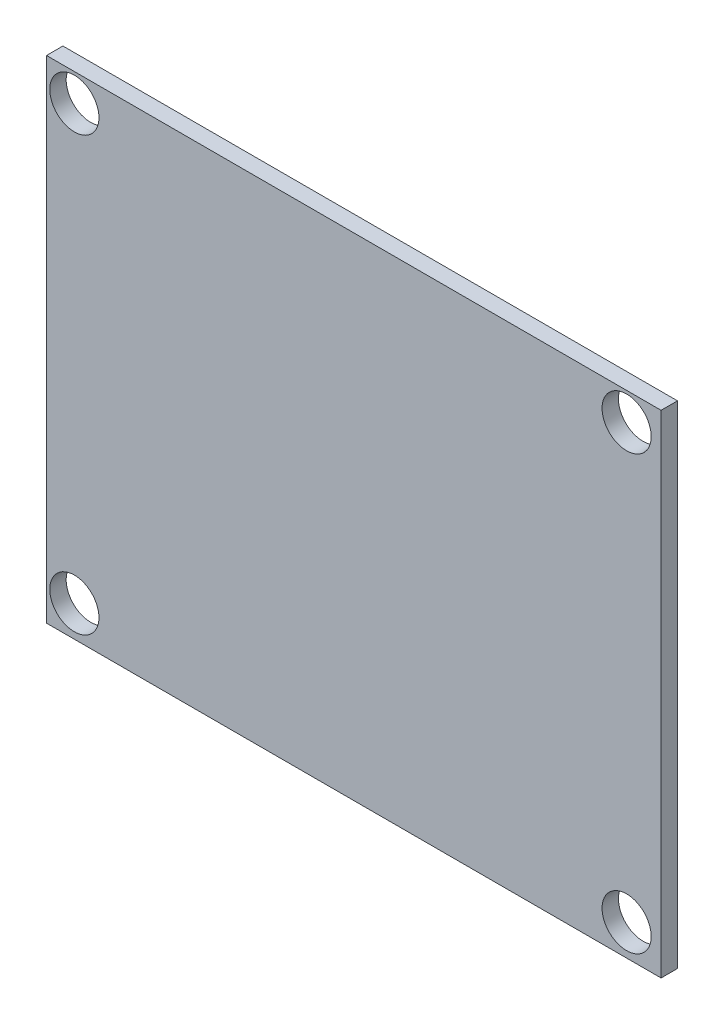
ISO-10303-21;
HEADER;
FILE_DESCRIPTION(('STEP AP214'),'2;1');
FILE_NAME('part.step','',(''),(''),'','','');
FILE_SCHEMA(('AUTOMOTIVE_DESIGN { 1 0 10303 214 1 1 1 1 }'));
ENDSEC;
DATA;
#1=APPLICATION_CONTEXT('core data for automotive mechanical design processes');
#2=APPLICATION_PROTOCOL_DEFINITION('international standard','automotive_design',2000,#1);
#3=PRODUCT_CONTEXT('',#1,'mechanical');
#4=PRODUCT('Part','Part','',(#3));
#5=PRODUCT_RELATED_PRODUCT_CATEGORY('part','',(#4));
#6=PRODUCT_DEFINITION_FORMATION('','',#4);
#7=PRODUCT_DEFINITION_CONTEXT('part definition',#1,'design');
#8=PRODUCT_DEFINITION('design','',#6,#7);
#9=PRODUCT_DEFINITION_SHAPE('','',#8);
#10=(LENGTH_UNIT() NAMED_UNIT(*) SI_UNIT(.MILLI.,.METRE.));
#11=(NAMED_UNIT(*) PLANE_ANGLE_UNIT() SI_UNIT($,.RADIAN.));
#12=(NAMED_UNIT(*) SI_UNIT($,.STERADIAN.) SOLID_ANGLE_UNIT());
#13=UNCERTAINTY_MEASURE_WITH_UNIT(LENGTH_MEASURE(1.E-05),#10,'distance_accuracy_value','');
#14=(GEOMETRIC_REPRESENTATION_CONTEXT(3) GLOBAL_UNCERTAINTY_ASSIGNED_CONTEXT((#13)) GLOBAL_UNIT_ASSIGNED_CONTEXT((#10,
#11,#12)) REPRESENTATION_CONTEXT('',''));
#15=CARTESIAN_POINT('',(0.,0.,0.));
#16=DIRECTION('',(0.,0.,1.));
#17=DIRECTION('',(1.,0.,0.));
#18=AXIS2_PLACEMENT_3D('',#15,#16,#17);
#19=CARTESIAN_POINT('',(-37.5,-30.,2.));
#20=DIRECTION('',(0.,1.,0.));
#21=DIRECTION('',(0.,0.,1.));
#22=AXIS2_PLACEMENT_3D('',#19,#20,#21);
#23=PLANE('',#22);
#24=DIRECTION('',(1.,0.,0.));
#25=VECTOR('',#24,1.);
#26=CARTESIAN_POINT('',(-37.5,-30.,0.));
#27=LINE('',#26,#25);
#28=CARTESIAN_POINT('',(-37.5,-30.,0.));
#29=VERTEX_POINT('',#28);
#30=CARTESIAN_POINT('',(37.5,-30.,0.));
#31=VERTEX_POINT('',#30);
#32=EDGE_CURVE('E96',#29,#31,#27,.T.);
#33=ORIENTED_EDGE('',*,*,#32,.T.);
#34=DIRECTION('',(0.,0.,-1.));
#35=VECTOR('',#34,1.);
#36=CARTESIAN_POINT('',(37.5,-30.,2.));
#37=LINE('',#36,#35);
#38=CARTESIAN_POINT('',(37.5,-30.,2.));
#39=VERTEX_POINT('',#38);
#40=EDGE_CURVE('E11',#39,#31,#37,.T.);
#41=ORIENTED_EDGE('',*,*,#40,.F.);
#42=DIRECTION('',(1.,0.,0.));
#43=VECTOR('',#42,1.);
#44=CARTESIAN_POINT('',(-37.5,-30.,2.));
#45=LINE('',#44,#43);
#46=CARTESIAN_POINT('',(-37.5,-30.,2.));
#47=VERTEX_POINT('',#46);
#48=EDGE_CURVE('E82',#47,#39,#45,.T.);
#49=ORIENTED_EDGE('',*,*,#48,.F.);
#50=DIRECTION('',(0.,0.,-1.));
#51=VECTOR('',#50,1.);
#52=CARTESIAN_POINT('',(-37.5,-30.,2.));
#53=LINE('',#52,#51);
#54=EDGE_CURVE('E49',#47,#29,#53,.T.);
#55=ORIENTED_EDGE('',*,*,#54,.T.);
#56=EDGE_LOOP('',(#33,#41,#49,#55));
#57=FACE_BOUND('',#56,.T.);
#58=ADVANCED_FACE('F33',(#57),#23,.F.);
#59=CARTESIAN_POINT('',(37.5,-30.,2.));
#60=DIRECTION('',(-1.,0.,0.));
#61=DIRECTION('',(0.,0.,1.));
#62=AXIS2_PLACEMENT_3D('',#59,#60,#61);
#63=PLANE('',#62);
#64=DIRECTION('',(0.,1.,0.));
#65=VECTOR('',#64,1.);
#66=CARTESIAN_POINT('',(37.5,-30.,0.));
#67=LINE('',#66,#65);
#68=CARTESIAN_POINT('',(37.5,30.,0.));
#69=VERTEX_POINT('',#68);
#70=EDGE_CURVE('E87',#31,#69,#67,.T.);
#71=ORIENTED_EDGE('',*,*,#70,.T.);
#72=DIRECTION('',(0.,0.,-1.));
#73=VECTOR('',#72,1.);
#74=CARTESIAN_POINT('',(37.5,30.,2.));
#75=LINE('',#74,#73);
#76=CARTESIAN_POINT('',(37.5,30.,2.));
#77=VERTEX_POINT('',#76);
#78=EDGE_CURVE('E41',#77,#69,#75,.T.);
#79=ORIENTED_EDGE('',*,*,#78,.F.);
#80=DIRECTION('',(0.,1.,0.));
#81=VECTOR('',#80,1.);
#82=CARTESIAN_POINT('',(37.5,-30.,2.));
#83=LINE('',#82,#81);
#84=EDGE_CURVE('E74',#39,#77,#83,.T.);
#85=ORIENTED_EDGE('',*,*,#84,.F.);
#86=ORIENTED_EDGE('',*,*,#40,.T.);
#87=EDGE_LOOP('',(#71,#79,#85,#86));
#88=FACE_BOUND('',#87,.T.);
#89=ADVANCED_FACE('F86',(#88),#63,.F.);
#90=CARTESIAN_POINT('',(-37.5,30.,2.));
#91=DIRECTION('',(0.,1.,0.));
#92=DIRECTION('',(0.,0.,1.));
#93=AXIS2_PLACEMENT_3D('',#90,#91,#92);
#94=PLANE('',#93);
#95=DIRECTION('',(1.,0.,0.));
#96=VECTOR('',#95,1.);
#97=CARTESIAN_POINT('',(-37.5,30.,0.));
#98=LINE('',#97,#96);
#99=CARTESIAN_POINT('',(-37.5,30.,0.));
#100=VERTEX_POINT('',#99);
#101=EDGE_CURVE('E100',#100,#69,#98,.T.);
#102=ORIENTED_EDGE('',*,*,#101,.F.);
#103=DIRECTION('',(0.,0.,-1.));
#104=VECTOR('',#103,1.);
#105=CARTESIAN_POINT('',(-37.5,30.,2.));
#106=LINE('',#105,#104);
#107=CARTESIAN_POINT('',(-37.5,30.,2.));
#108=VERTEX_POINT('',#107);
#109=EDGE_CURVE('E63',#108,#100,#106,.T.);
#110=ORIENTED_EDGE('',*,*,#109,.F.);
#111=DIRECTION('',(1.,0.,0.));
#112=VECTOR('',#111,1.);
#113=CARTESIAN_POINT('',(-37.5,30.,2.));
#114=LINE('',#113,#112);
#115=EDGE_CURVE('E81',#108,#77,#114,.T.);
#116=ORIENTED_EDGE('',*,*,#115,.T.);
#117=ORIENTED_EDGE('',*,*,#78,.T.);
#118=EDGE_LOOP('',(#102,#110,#116,#117));
#119=FACE_BOUND('',#118,.T.);
#120=ADVANCED_FACE('F90',(#119),#94,.T.);
#121=CARTESIAN_POINT('',(-37.5,-30.,2.));
#122=DIRECTION('',(-1.,0.,0.));
#123=DIRECTION('',(0.,0.,1.));
#124=AXIS2_PLACEMENT_3D('',#121,#122,#123);
#125=PLANE('',#124);
#126=DIRECTION('',(0.,1.,0.));
#127=VECTOR('',#126,1.);
#128=CARTESIAN_POINT('',(-37.5,-30.,0.));
#129=LINE('',#128,#127);
#130=EDGE_CURVE('E102',#29,#100,#129,.T.);
#131=ORIENTED_EDGE('',*,*,#130,.F.);
#132=ORIENTED_EDGE('',*,*,#54,.F.);
#133=DIRECTION('',(0.,1.,0.));
#134=VECTOR('',#133,1.);
#135=CARTESIAN_POINT('',(-37.5,-30.,2.));
#136=LINE('',#135,#134);
#137=EDGE_CURVE('E91',#47,#108,#136,.T.);
#138=ORIENTED_EDGE('',*,*,#137,.T.);
#139=ORIENTED_EDGE('',*,*,#109,.T.);
#140=EDGE_LOOP('',(#131,#132,#138,#139));
#141=FACE_BOUND('',#140,.T.);
#142=ADVANCED_FACE('F137',(#141),#125,.T.);
#143=CARTESIAN_POINT('',(0.,0.,2.));
#144=DIRECTION('',(0.,0.,1.));
#145=DIRECTION('',(1.,0.,0.));
#146=AXIS2_PLACEMENT_3D('',#143,#144,#145);
#147=PLANE('',#146);
#148=CARTESIAN_POINT('',(-34.1013230701448,26.6176400713585,2.));
#149=DIRECTION('',(0.,0.,1.));
#150=DIRECTION('',(1.,0.,0.));
#151=AXIS2_PLACEMENT_3D('',#148,#149,#150);
#152=CIRCLE('',#151,3.);
#153=CARTESIAN_POINT('',(-31.1013230701448,26.6176400713585,2.));
#154=VERTEX_POINT('',#153);
#155=EDGE_CURVE('E123',#154,#154,#152,.T.);
#156=ORIENTED_EDGE('',*,*,#155,.F.);
#157=EDGE_LOOP('',(#156));
#158=FACE_BOUND('',#157,.T.);
#159=CARTESIAN_POINT('',(33.2922762594652,26.6176400713585,2.));
#160=DIRECTION('',(0.,0.,1.));
#161=DIRECTION('',(1.,0.,0.));
#162=AXIS2_PLACEMENT_3D('',#159,#160,#161);
#163=CIRCLE('',#162,3.);
#164=CARTESIAN_POINT('',(36.2922762594652,26.6176400713585,2.));
#165=VERTEX_POINT('',#164);
#166=EDGE_CURVE('E117',#165,#165,#163,.T.);
#167=ORIENTED_EDGE('',*,*,#166,.F.);
#168=EDGE_LOOP('',(#167));
#169=FACE_BOUND('',#168,.T.);
#170=CARTESIAN_POINT('',(33.2922762594652,-26.2131166660187,2.));
#171=DIRECTION('',(0.,0.,1.));
#172=DIRECTION('',(1.,0.,0.));
#173=AXIS2_PLACEMENT_3D('',#170,#171,#172);
#174=CIRCLE('',#173,3.);
#175=CARTESIAN_POINT('',(36.2922762594652,-26.2131166660187,2.));
#176=VERTEX_POINT('',#175);
#177=EDGE_CURVE('E111',#176,#176,#174,.T.);
#178=ORIENTED_EDGE('',*,*,#177,.F.);
#179=EDGE_LOOP('',(#178));
#180=FACE_BOUND('',#179,.T.);
#181=CARTESIAN_POINT('',(-34.1013230701448,-26.2131166660187,2.));
#182=DIRECTION('',(0.,0.,1.));
#183=DIRECTION('',(1.,0.,0.));
#184=AXIS2_PLACEMENT_3D('',#181,#182,#183);
#185=CIRCLE('',#184,3.);
#186=CARTESIAN_POINT('',(-31.1013230701448,-26.2131166660187,2.));
#187=VERTEX_POINT('',#186);
#188=EDGE_CURVE('E108',#187,#187,#185,.T.);
#189=ORIENTED_EDGE('',*,*,#188,.F.);
#190=EDGE_LOOP('',(#189));
#191=FACE_BOUND('',#190,.T.);
#192=ORIENTED_EDGE('',*,*,#48,.T.);
#193=ORIENTED_EDGE('',*,*,#84,.T.);
#194=ORIENTED_EDGE('',*,*,#115,.F.);
#195=ORIENTED_EDGE('',*,*,#137,.F.);
#196=EDGE_LOOP('',(#192,#193,#194,#195));
#197=FACE_BOUND('',#196,.T.);
#198=ADVANCED_FACE('F78',(#158,#169,#180,#191,#197),#147,.T.);
#199=CARTESIAN_POINT('',(0.,0.,0.));
#200=DIRECTION('',(0.,0.,1.));
#201=DIRECTION('',(1.,0.,0.));
#202=AXIS2_PLACEMENT_3D('',#199,#200,#201);
#203=PLANE('',#202);
#204=CARTESIAN_POINT('',(-34.1013230701448,26.6176400713585,0.));
#205=DIRECTION('',(0.,0.,1.));
#206=DIRECTION('',(1.,0.,0.));
#207=AXIS2_PLACEMENT_3D('',#204,#205,#206);
#208=CIRCLE('',#207,3.);
#209=CARTESIAN_POINT('',(-31.1013230701448,26.6176400713585,0.));
#210=VERTEX_POINT('',#209);
#211=EDGE_CURVE('E126',#210,#210,#208,.T.);
#212=ORIENTED_EDGE('',*,*,#211,.T.);
#213=EDGE_LOOP('',(#212));
#214=FACE_BOUND('',#213,.T.);
#215=CARTESIAN_POINT('',(33.2922762594652,26.6176400713585,0.));
#216=DIRECTION('',(0.,0.,1.));
#217=DIRECTION('',(1.,0.,0.));
#218=AXIS2_PLACEMENT_3D('',#215,#216,#217);
#219=CIRCLE('',#218,3.);
#220=CARTESIAN_POINT('',(36.2922762594652,26.6176400713585,0.));
#221=VERTEX_POINT('',#220);
#222=EDGE_CURVE('E120',#221,#221,#219,.T.);
#223=ORIENTED_EDGE('',*,*,#222,.T.);
#224=EDGE_LOOP('',(#223));
#225=FACE_BOUND('',#224,.T.);
#226=CARTESIAN_POINT('',(33.2922762594652,-26.2131166660187,0.));
#227=DIRECTION('',(0.,0.,1.));
#228=DIRECTION('',(1.,0.,0.));
#229=AXIS2_PLACEMENT_3D('',#226,#227,#228);
#230=CIRCLE('',#229,3.);
#231=CARTESIAN_POINT('',(36.2922762594652,-26.2131166660187,0.));
#232=VERTEX_POINT('',#231);
#233=EDGE_CURVE('E114',#232,#232,#230,.T.);
#234=ORIENTED_EDGE('',*,*,#233,.T.);
#235=EDGE_LOOP('',(#234));
#236=FACE_BOUND('',#235,.T.);
#237=CARTESIAN_POINT('',(-34.1013230701448,-26.2131166660187,0.));
#238=DIRECTION('',(0.,0.,1.));
#239=DIRECTION('',(1.,0.,0.));
#240=AXIS2_PLACEMENT_3D('',#237,#238,#239);
#241=CIRCLE('',#240,3.);
#242=CARTESIAN_POINT('',(-31.1013230701448,-26.2131166660187,0.));
#243=VERTEX_POINT('',#242);
#244=EDGE_CURVE('E98',#243,#243,#241,.T.);
#245=ORIENTED_EDGE('',*,*,#244,.T.);
#246=EDGE_LOOP('',(#245));
#247=FACE_BOUND('',#246,.T.);
#248=ORIENTED_EDGE('',*,*,#32,.F.);
#249=ORIENTED_EDGE('',*,*,#130,.T.);
#250=ORIENTED_EDGE('',*,*,#101,.T.);
#251=ORIENTED_EDGE('',*,*,#70,.F.);
#252=EDGE_LOOP('',(#248,#249,#250,#251));
#253=FACE_BOUND('',#252,.T.);
#254=ADVANCED_FACE('F136',(#214,#225,#236,#247,#253),#203,.F.);
#255=CARTESIAN_POINT('',(-34.1013230701448,-26.2131166660187,0.));
#256=DIRECTION('',(0.,0.,1.));
#257=DIRECTION('',(1.,0.,0.));
#258=AXIS2_PLACEMENT_3D('',#255,#256,#257);
#259=CYLINDRICAL_SURFACE('',#258,3.);
#260=ORIENTED_EDGE('',*,*,#244,.F.);
#261=EDGE_LOOP('',(#260));
#262=FACE_BOUND('',#261,.T.);
#263=ORIENTED_EDGE('',*,*,#188,.T.);
#264=EDGE_LOOP('',(#263));
#265=FACE_BOUND('',#264,.T.);
#266=ADVANCED_FACE('F145',(#262,#265),#259,.F.);
#267=CARTESIAN_POINT('',(33.2922762594652,-26.2131166660187,0.));
#268=DIRECTION('',(0.,0.,1.));
#269=DIRECTION('',(1.,0.,0.));
#270=AXIS2_PLACEMENT_3D('',#267,#268,#269);
#271=CYLINDRICAL_SURFACE('',#270,3.);
#272=ORIENTED_EDGE('',*,*,#233,.F.);
#273=EDGE_LOOP('',(#272));
#274=FACE_BOUND('',#273,.T.);
#275=ORIENTED_EDGE('',*,*,#177,.T.);
#276=EDGE_LOOP('',(#275));
#277=FACE_BOUND('',#276,.T.);
#278=ADVANCED_FACE('F147',(#274,#277),#271,.F.);
#279=CARTESIAN_POINT('',(33.2922762594652,26.6176400713585,0.));
#280=DIRECTION('',(0.,0.,1.));
#281=DIRECTION('',(1.,0.,0.));
#282=AXIS2_PLACEMENT_3D('',#279,#280,#281);
#283=CYLINDRICAL_SURFACE('',#282,3.);
#284=ORIENTED_EDGE('',*,*,#222,.F.);
#285=EDGE_LOOP('',(#284));
#286=FACE_BOUND('',#285,.T.);
#287=ORIENTED_EDGE('',*,*,#166,.T.);
#288=EDGE_LOOP('',(#287));
#289=FACE_BOUND('',#288,.T.);
#290=ADVANCED_FACE('F154',(#286,#289),#283,.F.);
#291=CARTESIAN_POINT('',(-34.1013230701448,26.6176400713585,0.));
#292=DIRECTION('',(0.,0.,1.));
#293=DIRECTION('',(1.,0.,0.));
#294=AXIS2_PLACEMENT_3D('',#291,#292,#293);
#295=CYLINDRICAL_SURFACE('',#294,3.);
#296=ORIENTED_EDGE('',*,*,#211,.F.);
#297=EDGE_LOOP('',(#296));
#298=FACE_BOUND('',#297,.T.);
#299=ORIENTED_EDGE('',*,*,#155,.T.);
#300=EDGE_LOOP('',(#299));
#301=FACE_BOUND('',#300,.T.);
#302=ADVANCED_FACE('F132',(#298,#301),#295,.F.);
#303=CLOSED_SHELL('',(#58,#89,#120,#142,#198,#254,#266,#278,#290,#302));
#304=MANIFOLD_SOLID_BREP('B2',#303);
#305=ADVANCED_BREP_SHAPE_REPRESENTATION('',(#18,#304),#14);
#306=SHAPE_DEFINITION_REPRESENTATION(#9,#305);
ENDSEC;
END-ISO-10303-21;
